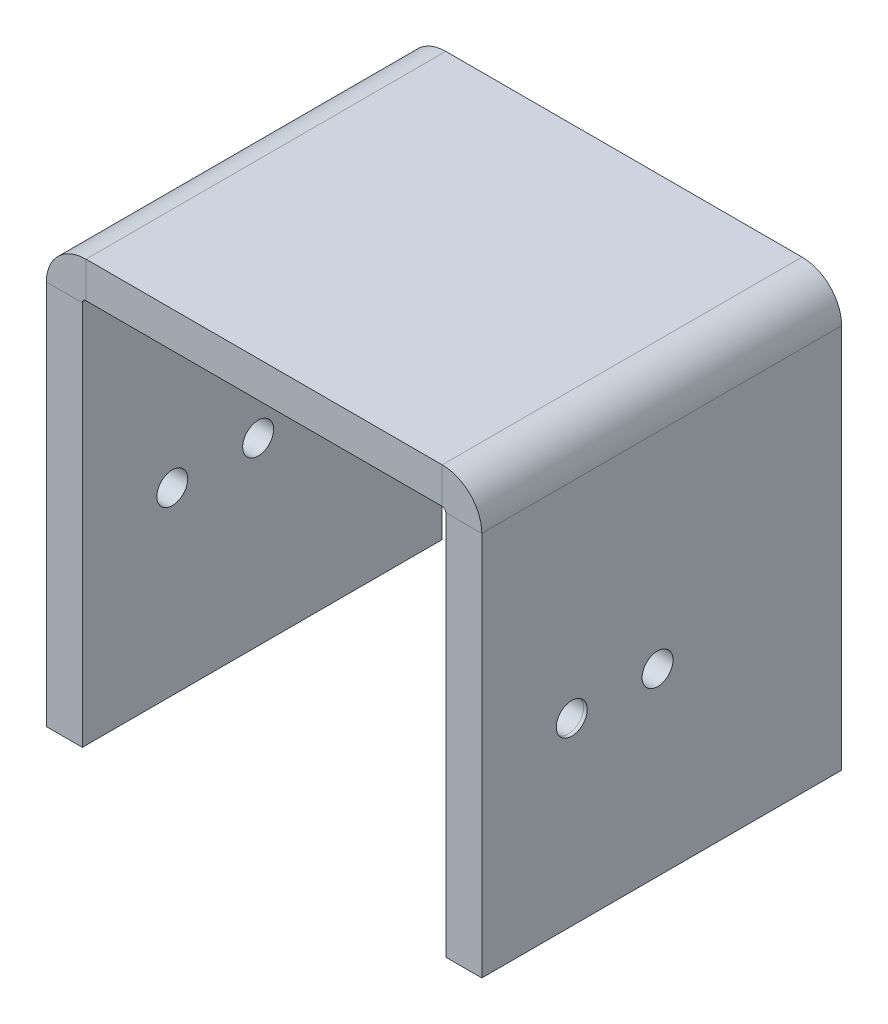
ISO-10303-21;
HEADER;
FILE_DESCRIPTION(('STEP AP214'),'2;1');
FILE_NAME('part.step','',(''),(''),'','','');
FILE_SCHEMA(('AUTOMOTIVE_DESIGN { 1 0 10303 214 1 1 1 1 }'));
ENDSEC;
DATA;
#1=APPLICATION_CONTEXT('core data for automotive mechanical design processes');
#2=APPLICATION_PROTOCOL_DEFINITION('international standard','automotive_design',2000,#1);
#3=PRODUCT_CONTEXT('',#1,'mechanical');
#4=PRODUCT('Part','Part','',(#3));
#5=PRODUCT_RELATED_PRODUCT_CATEGORY('part','',(#4));
#6=PRODUCT_DEFINITION_FORMATION('','',#4);
#7=PRODUCT_DEFINITION_CONTEXT('part definition',#1,'design');
#8=PRODUCT_DEFINITION('design','',#6,#7);
#9=PRODUCT_DEFINITION_SHAPE('','',#8);
#10=(LENGTH_UNIT() NAMED_UNIT(*) SI_UNIT(.MILLI.,.METRE.));
#11=(NAMED_UNIT(*) PLANE_ANGLE_UNIT() SI_UNIT($,.RADIAN.));
#12=(NAMED_UNIT(*) SI_UNIT($,.STERADIAN.) SOLID_ANGLE_UNIT());
#13=UNCERTAINTY_MEASURE_WITH_UNIT(LENGTH_MEASURE(1.E-05),#10,'distance_accuracy_value','');
#14=(GEOMETRIC_REPRESENTATION_CONTEXT(3) GLOBAL_UNCERTAINTY_ASSIGNED_CONTEXT((#13)) GLOBAL_UNIT_ASSIGNED_CONTEXT((#10,
#11,#12)) REPRESENTATION_CONTEXT('',''));
#15=CARTESIAN_POINT('',(0.,0.,0.));
#16=DIRECTION('',(0.,0.,1.));
#17=DIRECTION('',(1.,0.,0.));
#18=AXIS2_PLACEMENT_3D('',#15,#16,#17);
#19=CARTESIAN_POINT('',(29.75,-4.00000000000017,37.5));
#20=DIRECTION('',(-1.,0.,0.));
#21=DIRECTION('',(0.,-1.,0.));
#22=AXIS2_PLACEMENT_3D('',#19,#20,#21);
#23=CYLINDRICAL_SURFACE('',#22,2.15);
#24=CARTESIAN_POINT('',(-30.25,-4.00000000000018,37.5));
#25=DIRECTION('',(1.,0.,0.));
#26=DIRECTION('',(0.,-1.,0.));
#27=AXIS2_PLACEMENT_3D('',#24,#25,#26);
#28=CIRCLE('',#27,2.15);
#29=CARTESIAN_POINT('',(-30.25,-6.15000000000018,37.5));
#30=VERTEX_POINT('',#29);
#31=EDGE_CURVE('E248',#30,#30,#28,.T.);
#32=ORIENTED_EDGE('',*,*,#31,.F.);
#33=EDGE_LOOP('',(#32));
#34=FACE_BOUND('',#33,.T.);
#35=CARTESIAN_POINT('',(-29.75,-4.00000000000018,37.5));
#36=DIRECTION('',(1.,0.,0.));
#37=DIRECTION('',(0.,1.,0.));
#38=AXIS2_PLACEMENT_3D('',#35,#36,#37);
#39=CIRCLE('',#38,2.15);
#40=CARTESIAN_POINT('',(-29.75,-1.85000000000018,37.5));
#41=VERTEX_POINT('',#40);
#42=EDGE_CURVE('E12',#41,#41,#39,.T.);
#43=ORIENTED_EDGE('',*,*,#42,.T.);
#44=EDGE_LOOP('',(#43));
#45=FACE_BOUND('',#44,.T.);
#46=ADVANCED_FACE('F37',(#34,#45),#23,.F.);
#47=CARTESIAN_POINT('',(24.75,24.9999999999997,50.));
#48=DIRECTION('',(0.,0.,1.));
#49=DIRECTION('',(1.,0.,0.));
#50=AXIS2_PLACEMENT_3D('',#47,#48,#49);
#51=PLANE('',#50);
#52=DIRECTION('',(0.,1.,0.));
#53=VECTOR('',#52,1.);
#54=CARTESIAN_POINT('',(24.75,24.9999999999997,50.));
#55=LINE('',#54,#53);
#56=CARTESIAN_POINT('',(24.75,24.9999999999997,50.));
#57=VERTEX_POINT('',#56);
#58=CARTESIAN_POINT('',(24.75,29.9999999999997,50.));
#59=VERTEX_POINT('',#58);
#60=EDGE_CURVE('E46',#57,#59,#55,.T.);
#61=ORIENTED_EDGE('',*,*,#60,.F.);
#62=CARTESIAN_POINT('',(24.75,24.4999999999997,50.));
#63=DIRECTION('',(0.,0.,-1.));
#64=DIRECTION('',(-1.,0.,0.));
#65=AXIS2_PLACEMENT_3D('',#62,#63,#64);
#66=CIRCLE('',#65,0.5);
#67=CARTESIAN_POINT('',(25.25,24.4999999999997,50.));
#68=VERTEX_POINT('',#67);
#69=EDGE_CURVE('E304',#68,#57,#66,.F.);
#70=ORIENTED_EDGE('',*,*,#69,.F.);
#71=DIRECTION('',(-1.,0.,0.));
#72=VECTOR('',#71,1.);
#73=CARTESIAN_POINT('',(30.25,24.4999999999997,50.));
#74=LINE('',#73,#72);
#75=CARTESIAN_POINT('',(30.25,24.4999999999997,50.));
#76=VERTEX_POINT('',#75);
#77=EDGE_CURVE('E147',#76,#68,#74,.T.);
#78=ORIENTED_EDGE('',*,*,#77,.F.);
#79=CARTESIAN_POINT('',(24.75,24.4999999999997,50.));
#80=DIRECTION('',(0.,0.,1.));
#81=DIRECTION('',(1.,0.,0.));
#82=AXIS2_PLACEMENT_3D('',#79,#80,#81);
#83=CIRCLE('',#82,5.5);
#84=EDGE_CURVE('E150',#76,#59,#83,.T.);
#85=ORIENTED_EDGE('',*,*,#84,.T.);
#86=EDGE_LOOP('',(#61,#70,#78,#85));
#87=FACE_BOUND('',#86,.T.);
#88=ADVANCED_FACE('F39',(#87),#51,.T.);
#89=CARTESIAN_POINT('',(30.25,24.4999999999997,50.));
#90=DIRECTION('',(0.,0.,1.));
#91=DIRECTION('',(1.,0.,0.));
#92=AXIS2_PLACEMENT_3D('',#89,#90,#91);
#93=PLANE('',#92);
#94=DIRECTION('',(-1.,0.,0.));
#95=VECTOR('',#94,1.);
#96=CARTESIAN_POINT('',(-25.25,24.9999999999997,50.));
#97=LINE('',#96,#95);
#98=CARTESIAN_POINT('',(-24.75,24.9999999999997,50.));
#99=VERTEX_POINT('',#98);
#100=EDGE_CURVE('E142',#57,#99,#97,.T.);
#101=ORIENTED_EDGE('',*,*,#100,.F.);
#102=ORIENTED_EDGE('',*,*,#60,.T.);
#103=DIRECTION('',(1.,0.,0.));
#104=VECTOR('',#103,1.);
#105=CARTESIAN_POINT('',(-25.25,29.9999999999997,50.));
#106=LINE('',#105,#104);
#107=CARTESIAN_POINT('',(-24.75,29.9999999999997,50.));
#108=VERTEX_POINT('',#107);
#109=EDGE_CURVE('E139',#59,#108,#106,.F.);
#110=ORIENTED_EDGE('',*,*,#109,.T.);
#111=DIRECTION('',(0.,-1.,0.));
#112=VECTOR('',#111,1.);
#113=CARTESIAN_POINT('',(-24.75,29.9999999999997,50.));
#114=LINE('',#113,#112);
#115=EDGE_CURVE('E233',#108,#99,#114,.T.);
#116=ORIENTED_EDGE('',*,*,#115,.T.);
#117=EDGE_LOOP('',(#101,#102,#110,#116));
#118=FACE_BOUND('',#117,.T.);
#119=ADVANCED_FACE('F137',(#118),#93,.T.);
#120=CARTESIAN_POINT('',(25.25,24.4999999999997,0.));
#121=DIRECTION('',(0.,0.,-1.));
#122=DIRECTION('',(-1.,0.,0.));
#123=AXIS2_PLACEMENT_3D('',#120,#121,#122);
#124=PLANE('',#123);
#125=DIRECTION('',(1.,0.,0.));
#126=VECTOR('',#125,1.);
#127=CARTESIAN_POINT('',(25.25,24.4999999999997,0.));
#128=LINE('',#127,#126);
#129=CARTESIAN_POINT('',(25.25,24.4999999999997,0.));
#130=VERTEX_POINT('',#129);
#131=CARTESIAN_POINT('',(30.25,24.4999999999997,0.));
#132=VERTEX_POINT('',#131);
#133=EDGE_CURVE('E238',#130,#132,#128,.T.);
#134=ORIENTED_EDGE('',*,*,#133,.F.);
#135=CARTESIAN_POINT('',(24.75,24.4999999999997,0.));
#136=DIRECTION('',(0.,0.,-1.));
#137=DIRECTION('',(-1.,0.,0.));
#138=AXIS2_PLACEMENT_3D('',#135,#136,#137);
#139=CIRCLE('',#138,0.5);
#140=CARTESIAN_POINT('',(24.75,24.9999999999997,0.));
#141=VERTEX_POINT('',#140);
#142=EDGE_CURVE('E190',#130,#141,#139,.F.);
#143=ORIENTED_EDGE('',*,*,#142,.T.);
#144=DIRECTION('',(0.,-1.,0.));
#145=VECTOR('',#144,1.);
#146=CARTESIAN_POINT('',(24.75,29.9999999999997,0.));
#147=LINE('',#146,#145);
#148=CARTESIAN_POINT('',(24.75,29.9999999999997,0.));
#149=VERTEX_POINT('',#148);
#150=EDGE_CURVE('E236',#149,#141,#147,.T.);
#151=ORIENTED_EDGE('',*,*,#150,.F.);
#152=CARTESIAN_POINT('',(24.75,24.4999999999997,0.));
#153=DIRECTION('',(0.,0.,1.));
#154=DIRECTION('',(1.,0.,0.));
#155=AXIS2_PLACEMENT_3D('',#152,#153,#154);
#156=CIRCLE('',#155,5.5);
#157=EDGE_CURVE('E162',#132,#149,#156,.T.);
#158=ORIENTED_EDGE('',*,*,#157,.F.);
#159=EDGE_LOOP('',(#134,#143,#151,#158));
#160=FACE_BOUND('',#159,.T.);
#161=ADVANCED_FACE('F322',(#160),#124,.T.);
#162=CARTESIAN_POINT('',(24.75,29.9999999999997,0.));
#163=DIRECTION('',(0.,0.,-1.));
#164=DIRECTION('',(-1.,0.,0.));
#165=AXIS2_PLACEMENT_3D('',#162,#163,#164);
#166=PLANE('',#165);
#167=DIRECTION('',(0.,1.,0.));
#168=VECTOR('',#167,1.);
#169=CARTESIAN_POINT('',(25.25,24.9999999999997,0.));
#170=LINE('',#169,#168);
#171=CARTESIAN_POINT('',(25.25,-29.0000000000003,0.));
#172=VERTEX_POINT('',#171);
#173=EDGE_CURVE('E193',#172,#130,#170,.T.);
#174=ORIENTED_EDGE('',*,*,#173,.T.);
#175=ORIENTED_EDGE('',*,*,#133,.T.);
#176=DIRECTION('',(0.,1.,0.));
#177=VECTOR('',#176,1.);
#178=CARTESIAN_POINT('',(30.25,24.9999999999997,0.));
#179=LINE('',#178,#177);
#180=CARTESIAN_POINT('',(30.25,-29.0000000000003,0.));
#181=VERTEX_POINT('',#180);
#182=EDGE_CURVE('E199',#181,#132,#179,.T.);
#183=ORIENTED_EDGE('',*,*,#182,.F.);
#184=DIRECTION('',(-1.,0.,0.));
#185=VECTOR('',#184,1.);
#186=CARTESIAN_POINT('',(30.25,-29.0000000000003,0.));
#187=LINE('',#186,#185);
#188=EDGE_CURVE('E196',#181,#172,#187,.T.);
#189=ORIENTED_EDGE('',*,*,#188,.T.);
#190=EDGE_LOOP('',(#174,#175,#183,#189));
#191=FACE_BOUND('',#190,.T.);
#192=ADVANCED_FACE('F723',(#191),#166,.T.);
#193=CARTESIAN_POINT('',(-25.25,24.4999999999997,50.));
#194=DIRECTION('',(0.,0.,1.));
#195=DIRECTION('',(1.,0.,0.));
#196=AXIS2_PLACEMENT_3D('',#193,#194,#195);
#197=PLANE('',#196);
#198=DIRECTION('',(-1.,0.,0.));
#199=VECTOR('',#198,1.);
#200=CARTESIAN_POINT('',(-25.25,24.4999999999997,50.));
#201=LINE('',#200,#199);
#202=CARTESIAN_POINT('',(-25.25,24.4999999999997,50.));
#203=VERTEX_POINT('',#202);
#204=CARTESIAN_POINT('',(-30.25,24.4999999999997,50.));
#205=VERTEX_POINT('',#204);
#206=EDGE_CURVE('E54',#203,#205,#201,.T.);
#207=ORIENTED_EDGE('',*,*,#206,.F.);
#208=CARTESIAN_POINT('',(-24.75,24.4999999999997,50.));
#209=DIRECTION('',(0.,0.,-1.));
#210=DIRECTION('',(-1.,0.,0.));
#211=AXIS2_PLACEMENT_3D('',#208,#209,#210);
#212=CIRCLE('',#211,0.5);
#213=EDGE_CURVE('E300',#99,#203,#212,.F.);
#214=ORIENTED_EDGE('',*,*,#213,.F.);
#215=ORIENTED_EDGE('',*,*,#115,.F.);
#216=CARTESIAN_POINT('',(-24.75,24.4999999999997,50.));
#217=DIRECTION('',(0.,0.,1.));
#218=DIRECTION('',(1.,0.,0.));
#219=AXIS2_PLACEMENT_3D('',#216,#217,#218);
#220=CIRCLE('',#219,5.5);
#221=EDGE_CURVE('E170',#108,#205,#220,.T.);
#222=ORIENTED_EDGE('',*,*,#221,.T.);
#223=EDGE_LOOP('',(#207,#214,#215,#222));
#224=FACE_BOUND('',#223,.T.);
#225=ADVANCED_FACE('F713',(#224),#197,.T.);
#226=CARTESIAN_POINT('',(-24.75,29.9999999999997,50.));
#227=DIRECTION('',(0.,0.,1.));
#228=DIRECTION('',(1.,0.,0.));
#229=AXIS2_PLACEMENT_3D('',#226,#227,#228);
#230=PLANE('',#229);
#231=DIRECTION('',(0.,-1.,0.));
#232=VECTOR('',#231,1.);
#233=CARTESIAN_POINT('',(-25.25,24.9999999999997,50.));
#234=LINE('',#233,#232);
#235=CARTESIAN_POINT('',(-25.25,-29.0000000000003,50.));
#236=VERTEX_POINT('',#235);
#237=EDGE_CURVE('E297',#203,#236,#234,.T.);
#238=ORIENTED_EDGE('',*,*,#237,.F.);
#239=ORIENTED_EDGE('',*,*,#206,.T.);
#240=DIRECTION('',(0.,-1.,0.));
#241=VECTOR('',#240,1.);
#242=CARTESIAN_POINT('',(-30.25,24.9999999999997,50.));
#243=LINE('',#242,#241);
#244=CARTESIAN_POINT('',(-30.25,-29.0000000000003,50.));
#245=VERTEX_POINT('',#244);
#246=EDGE_CURVE('E108',#205,#245,#243,.T.);
#247=ORIENTED_EDGE('',*,*,#246,.T.);
#248=DIRECTION('',(-1.,0.,0.));
#249=VECTOR('',#248,1.);
#250=CARTESIAN_POINT('',(-25.25,-29.0000000000003,50.));
#251=LINE('',#250,#249);
#252=EDGE_CURVE('E294',#236,#245,#251,.T.);
#253=ORIENTED_EDGE('',*,*,#252,.F.);
#254=EDGE_LOOP('',(#238,#239,#247,#253));
#255=FACE_BOUND('',#254,.T.);
#256=ADVANCED_FACE('F349',(#255),#230,.T.);
#257=CARTESIAN_POINT('',(-24.75,24.9999999999997,0.));
#258=DIRECTION('',(0.,0.,-1.));
#259=DIRECTION('',(-1.,0.,0.));
#260=AXIS2_PLACEMENT_3D('',#257,#258,#259);
#261=PLANE('',#260);
#262=DIRECTION('',(0.,1.,0.));
#263=VECTOR('',#262,1.);
#264=CARTESIAN_POINT('',(-24.75,24.9999999999997,0.));
#265=LINE('',#264,#263);
#266=CARTESIAN_POINT('',(-24.75,24.9999999999997,0.));
#267=VERTEX_POINT('',#266);
#268=CARTESIAN_POINT('',(-24.75,29.9999999999997,0.));
#269=VERTEX_POINT('',#268);
#270=EDGE_CURVE('E95',#267,#269,#265,.T.);
#271=ORIENTED_EDGE('',*,*,#270,.F.);
#272=CARTESIAN_POINT('',(-24.75,24.4999999999997,0.));
#273=DIRECTION('',(0.,0.,-1.));
#274=DIRECTION('',(-1.,0.,0.));
#275=AXIS2_PLACEMENT_3D('',#272,#273,#274);
#276=CIRCLE('',#275,0.5);
#277=CARTESIAN_POINT('',(-25.25,24.4999999999997,0.));
#278=VERTEX_POINT('',#277);
#279=EDGE_CURVE('E186',#267,#278,#276,.F.);
#280=ORIENTED_EDGE('',*,*,#279,.T.);
#281=DIRECTION('',(1.,0.,0.));
#282=VECTOR('',#281,1.);
#283=CARTESIAN_POINT('',(-30.25,24.4999999999997,0.));
#284=LINE('',#283,#282);
#285=CARTESIAN_POINT('',(-30.25,24.4999999999997,0.));
#286=VERTEX_POINT('',#285);
#287=EDGE_CURVE('E102',#286,#278,#284,.T.);
#288=ORIENTED_EDGE('',*,*,#287,.F.);
#289=CARTESIAN_POINT('',(-24.75,24.4999999999997,0.));
#290=DIRECTION('',(0.,0.,1.));
#291=DIRECTION('',(1.,0.,0.));
#292=AXIS2_PLACEMENT_3D('',#289,#290,#291);
#293=CIRCLE('',#292,5.5);
#294=EDGE_CURVE('E205',#269,#286,#293,.T.);
#295=ORIENTED_EDGE('',*,*,#294,.F.);
#296=EDGE_LOOP('',(#271,#280,#288,#295));
#297=FACE_BOUND('',#296,.T.);
#298=ADVANCED_FACE('F337',(#297),#261,.T.);
#299=CARTESIAN_POINT('',(-30.25,24.4999999999997,0.));
#300=DIRECTION('',(0.,0.,-1.));
#301=DIRECTION('',(-1.,0.,0.));
#302=AXIS2_PLACEMENT_3D('',#299,#300,#301);
#303=PLANE('',#302);
#304=DIRECTION('',(-1.,0.,0.));
#305=VECTOR('',#304,1.);
#306=CARTESIAN_POINT('',(-25.25,24.9999999999997,0.));
#307=LINE('',#306,#305);
#308=EDGE_CURVE('E188',#141,#267,#307,.T.);
#309=ORIENTED_EDGE('',*,*,#308,.T.);
#310=ORIENTED_EDGE('',*,*,#270,.T.);
#311=DIRECTION('',(1.,0.,0.));
#312=VECTOR('',#311,1.);
#313=CARTESIAN_POINT('',(-25.25,29.9999999999997,0.));
#314=LINE('',#313,#312);
#315=EDGE_CURVE('E203',#149,#269,#314,.F.);
#316=ORIENTED_EDGE('',*,*,#315,.F.);
#317=ORIENTED_EDGE('',*,*,#150,.T.);
#318=EDGE_LOOP('',(#309,#310,#316,#317));
#319=FACE_BOUND('',#318,.T.);
#320=ADVANCED_FACE('F324',(#319),#303,.T.);
#321=CARTESIAN_POINT('',(-30.25,24.9999999999997,50.));
#322=DIRECTION('',(1.,0.,0.));
#323=DIRECTION('',(0.,1.,0.));
#324=AXIS2_PLACEMENT_3D('',#321,#322,#323);
#325=PLANE('',#324);
#326=ORIENTED_EDGE('',*,*,#31,.T.);
#327=EDGE_LOOP('',(#326));
#328=FACE_BOUND('',#327,.T.);
#329=CARTESIAN_POINT('',(-30.25,-4.00000000000018,12.5));
#330=DIRECTION('',(-1.,0.,0.));
#331=DIRECTION('',(0.,-1.,0.));
#332=AXIS2_PLACEMENT_3D('',#329,#330,#331);
#333=CIRCLE('',#332,2.15);
#334=CARTESIAN_POINT('',(-30.25,-6.15000000000018,12.5));
#335=VERTEX_POINT('',#334);
#336=EDGE_CURVE('E252',#335,#335,#333,.T.);
#337=ORIENTED_EDGE('',*,*,#336,.F.);
#338=EDGE_LOOP('',(#337));
#339=FACE_BOUND('',#338,.T.);
#340=DIRECTION('',(0.,-1.,0.));
#341=VECTOR('',#340,1.);
#342=CARTESIAN_POINT('',(-30.25,24.9999999999997,0.));
#343=LINE('',#342,#341);
#344=CARTESIAN_POINT('',(-30.25,-29.0000000000003,0.));
#345=VERTEX_POINT('',#344);
#346=EDGE_CURVE('E176',#286,#345,#343,.T.);
#347=ORIENTED_EDGE('',*,*,#346,.T.);
#348=DIRECTION('',(0.,0.,-1.));
#349=VECTOR('',#348,1.);
#350=CARTESIAN_POINT('',(-30.25,-29.0000000000003,50.));
#351=LINE('',#350,#349);
#352=EDGE_CURVE('E229',#245,#345,#351,.T.);
#353=ORIENTED_EDGE('',*,*,#352,.F.);
#354=ORIENTED_EDGE('',*,*,#246,.F.);
#355=DIRECTION('',(0.,0.,-1.));
#356=VECTOR('',#355,1.);
#357=CARTESIAN_POINT('',(-30.25,24.4999999999997,50.));
#358=LINE('',#357,#356);
#359=EDGE_CURVE('E172',#205,#286,#358,.T.);
#360=ORIENTED_EDGE('',*,*,#359,.T.);
#361=EDGE_LOOP('',(#347,#353,#354,#360));
#362=FACE_BOUND('',#361,.T.);
#363=ADVANCED_FACE('F343',(#328,#339,#362),#325,.F.);
#364=CARTESIAN_POINT('',(-25.25,-29.0000000000003,50.));
#365=DIRECTION('',(0.,-1.,0.));
#366=DIRECTION('',(0.,0.,-1.));
#367=AXIS2_PLACEMENT_3D('',#364,#365,#366);
#368=PLANE('',#367);
#369=DIRECTION('',(-1.,0.,0.));
#370=VECTOR('',#369,1.);
#371=CARTESIAN_POINT('',(-25.25,-29.0000000000003,0.));
#372=LINE('',#371,#370);
#373=CARTESIAN_POINT('',(-25.25,-29.0000000000003,0.));
#374=VERTEX_POINT('',#373);
#375=EDGE_CURVE('E179',#374,#345,#372,.T.);
#376=ORIENTED_EDGE('',*,*,#375,.F.);
#377=DIRECTION('',(0.,0.,-1.));
#378=VECTOR('',#377,1.);
#379=CARTESIAN_POINT('',(-25.25,-29.0000000000003,50.));
#380=LINE('',#379,#378);
#381=EDGE_CURVE('E227',#236,#374,#380,.T.);
#382=ORIENTED_EDGE('',*,*,#381,.F.);
#383=ORIENTED_EDGE('',*,*,#252,.T.);
#384=ORIENTED_EDGE('',*,*,#352,.T.);
#385=EDGE_LOOP('',(#376,#382,#383,#384));
#386=FACE_BOUND('',#385,.T.);
#387=ADVANCED_FACE('F348',(#386),#368,.T.);
#388=CARTESIAN_POINT('',(-25.25,24.9999999999997,50.));
#389=DIRECTION('',(1.,0.,0.));
#390=DIRECTION('',(0.,1.,0.));
#391=AXIS2_PLACEMENT_3D('',#388,#389,#390);
#392=PLANE('',#391);
#393=CARTESIAN_POINT('',(-25.25,-4.00000000000018,25.5741949753525));
#394=DIRECTION('',(1.,0.,0.));
#395=DIRECTION('',(0.,1.,0.));
#396=AXIS2_PLACEMENT_3D('',#393,#394,#395);
#397=CIRCLE('',#396,2.15);
#398=CARTESIAN_POINT('',(-25.25,-1.85000000000018,25.5741949753525));
#399=VERTEX_POINT('',#398);
#400=EDGE_CURVE('E255',#399,#399,#397,.T.);
#401=ORIENTED_EDGE('',*,*,#400,.F.);
#402=EDGE_LOOP('',(#401));
#403=FACE_BOUND('',#402,.T.);
#404=CARTESIAN_POINT('',(-25.25,-4.00000000000018,37.5));
#405=DIRECTION('',(1.,0.,0.));
#406=DIRECTION('',(0.,1.,0.));
#407=AXIS2_PLACEMENT_3D('',#404,#405,#406);
#408=CIRCLE('',#407,2.15);
#409=CARTESIAN_POINT('',(-25.25,-1.85000000000018,37.5));
#410=VERTEX_POINT('',#409);
#411=EDGE_CURVE('E247',#410,#410,#408,.F.);
#412=ORIENTED_EDGE('',*,*,#411,.T.);
#413=EDGE_LOOP('',(#412));
#414=FACE_BOUND('',#413,.T.);
#415=CARTESIAN_POINT('',(-25.25,-4.00000000000018,12.5));
#416=DIRECTION('',(1.,0.,0.));
#417=DIRECTION('',(0.,1.,0.));
#418=AXIS2_PLACEMENT_3D('',#415,#416,#417);
#419=CIRCLE('',#418,2.15);
#420=CARTESIAN_POINT('',(-25.25,-1.85000000000018,12.5));
#421=VERTEX_POINT('',#420);
#422=EDGE_CURVE('E243',#421,#421,#419,.T.);
#423=ORIENTED_EDGE('',*,*,#422,.F.);
#424=EDGE_LOOP('',(#423));
#425=FACE_BOUND('',#424,.T.);
#426=DIRECTION('',(0.,-1.,0.));
#427=VECTOR('',#426,1.);
#428=CARTESIAN_POINT('',(-25.25,24.9999999999997,0.));
#429=LINE('',#428,#427);
#430=EDGE_CURVE('E183',#278,#374,#429,.T.);
#431=ORIENTED_EDGE('',*,*,#430,.F.);
#432=DIRECTION('',(0.,0.,-1.));
#433=VECTOR('',#432,1.);
#434=CARTESIAN_POINT('',(-25.25,24.4999999999997,50.));
#435=LINE('',#434,#433);
#436=EDGE_CURVE('E224',#203,#278,#435,.T.);
#437=ORIENTED_EDGE('',*,*,#436,.F.);
#438=ORIENTED_EDGE('',*,*,#237,.T.);
#439=ORIENTED_EDGE('',*,*,#381,.T.);
#440=EDGE_LOOP('',(#431,#437,#438,#439));
#441=FACE_BOUND('',#440,.T.);
#442=ADVANCED_FACE('F351',(#403,#414,#425,#441),#392,.T.);
#443=CARTESIAN_POINT('',(-24.75,24.4999999999997,50.));
#444=DIRECTION('',(0.,0.,-1.));
#445=DIRECTION('',(-1.,0.,0.));
#446=AXIS2_PLACEMENT_3D('',#443,#444,#445);
#447=CYLINDRICAL_SURFACE('',#446,0.5);
#448=ORIENTED_EDGE('',*,*,#279,.F.);
#449=DIRECTION('',(0.,0.,-1.));
#450=VECTOR('',#449,1.);
#451=CARTESIAN_POINT('',(-24.75,24.9999999999997,50.));
#452=LINE('',#451,#450);
#453=EDGE_CURVE('E221',#99,#267,#452,.T.);
#454=ORIENTED_EDGE('',*,*,#453,.F.);
#455=ORIENTED_EDGE('',*,*,#213,.T.);
#456=ORIENTED_EDGE('',*,*,#436,.T.);
#457=EDGE_LOOP('',(#448,#454,#455,#456));
#458=FACE_BOUND('',#457,.T.);
#459=ADVANCED_FACE('F334',(#458),#447,.F.);
#460=CARTESIAN_POINT('',(-25.25,24.9999999999997,50.));
#461=DIRECTION('',(0.,-1.,0.));
#462=DIRECTION('',(0.,0.,-1.));
#463=AXIS2_PLACEMENT_3D('',#460,#461,#462);
#464=PLANE('',#463);
#465=CARTESIAN_POINT('',(-14.9999999999999,24.9999999999997,9.89596793341776));
#466=DIRECTION('',(0.,-1.,0.));
#467=DIRECTION('',(1.,0.,0.));
#468=AXIS2_PLACEMENT_3D('',#465,#466,#467);
#469=CIRCLE('',#468,1.65);
#470=CARTESIAN_POINT('',(-13.3499999999999,24.9999999999997,9.89596793341777));
#471=VERTEX_POINT('',#470);
#472=EDGE_CURVE('E275',#471,#471,#469,.T.);
#473=ORIENTED_EDGE('',*,*,#472,.F.);
#474=EDGE_LOOP('',(#473));
#475=FACE_BOUND('',#474,.T.);
#476=CARTESIAN_POINT('',(15.1040320665822,24.9999999999997,9.89596793341782));
#477=DIRECTION('',(0.,-1.,0.));
#478=DIRECTION('',(0.,0.,1.));
#479=AXIS2_PLACEMENT_3D('',#476,#477,#478);
#480=CIRCLE('',#479,1.65);
#481=CARTESIAN_POINT('',(15.1040320665822,24.9999999999997,11.5459679334178));
#482=VERTEX_POINT('',#481);
#483=EDGE_CURVE('E281',#482,#482,#480,.T.);
#484=ORIENTED_EDGE('',*,*,#483,.F.);
#485=EDGE_LOOP('',(#484));
#486=FACE_BOUND('',#485,.T.);
#487=CARTESIAN_POINT('',(15.104032066582,24.9999999999997,40.0000000000002));
#488=DIRECTION('',(0.,-1.,0.));
#489=DIRECTION('',(-1.,0.,0.));
#490=AXIS2_PLACEMENT_3D('',#487,#488,#489);
#491=CIRCLE('',#490,1.65);
#492=CARTESIAN_POINT('',(13.454032066582,24.9999999999997,40.0000000000002));
#493=VERTEX_POINT('',#492);
#494=EDGE_CURVE('E270',#493,#493,#491,.T.);
#495=ORIENTED_EDGE('',*,*,#494,.F.);
#496=EDGE_LOOP('',(#495));
#497=FACE_BOUND('',#496,.T.);
#498=CARTESIAN_POINT('',(-15.,24.9999999999997,40.));
#499=DIRECTION('',(0.,-1.,0.));
#500=DIRECTION('',(0.,0.,-1.));
#501=AXIS2_PLACEMENT_3D('',#498,#499,#500);
#502=CIRCLE('',#501,1.65);
#503=CARTESIAN_POINT('',(-15.,24.9999999999997,38.35));
#504=VERTEX_POINT('',#503);
#505=EDGE_CURVE('E274',#504,#504,#502,.T.);
#506=ORIENTED_EDGE('',*,*,#505,.F.);
#507=EDGE_LOOP('',(#506));
#508=FACE_BOUND('',#507,.T.);
#509=ORIENTED_EDGE('',*,*,#308,.F.);
#510=DIRECTION('',(0.,0.,-1.));
#511=VECTOR('',#510,1.);
#512=CARTESIAN_POINT('',(24.75,24.9999999999997,50.));
#513=LINE('',#512,#511);
#514=EDGE_CURVE('E218',#57,#141,#513,.T.);
#515=ORIENTED_EDGE('',*,*,#514,.F.);
#516=ORIENTED_EDGE('',*,*,#100,.T.);
#517=ORIENTED_EDGE('',*,*,#453,.T.);
#518=EDGE_LOOP('',(#509,#515,#516,#517));
#519=FACE_BOUND('',#518,.T.);
#520=ADVANCED_FACE('F329',(#475,#486,#497,#508,#519),#464,.T.);
#521=CARTESIAN_POINT('',(24.75,24.4999999999997,50.));
#522=DIRECTION('',(0.,0.,-1.));
#523=DIRECTION('',(-1.,0.,0.));
#524=AXIS2_PLACEMENT_3D('',#521,#522,#523);
#525=CYLINDRICAL_SURFACE('',#524,0.5);
#526=ORIENTED_EDGE('',*,*,#142,.F.);
#527=DIRECTION('',(0.,0.,-1.));
#528=VECTOR('',#527,1.);
#529=CARTESIAN_POINT('',(25.25,24.4999999999997,50.));
#530=LINE('',#529,#528);
#531=EDGE_CURVE('E215',#68,#130,#530,.T.);
#532=ORIENTED_EDGE('',*,*,#531,.F.);
#533=ORIENTED_EDGE('',*,*,#69,.T.);
#534=ORIENTED_EDGE('',*,*,#514,.T.);
#535=EDGE_LOOP('',(#526,#532,#533,#534));
#536=FACE_BOUND('',#535,.T.);
#537=ADVANCED_FACE('F327',(#536),#525,.F.);
#538=CARTESIAN_POINT('',(25.25,24.9999999999997,50.));
#539=DIRECTION('',(-1.,0.,0.));
#540=DIRECTION('',(0.,-1.,0.));
#541=AXIS2_PLACEMENT_3D('',#538,#539,#540);
#542=PLANE('',#541);
#543=CARTESIAN_POINT('',(25.25,-4.00000000000017,25.5741949753525));
#544=DIRECTION('',(-1.,0.,0.));
#545=DIRECTION('',(0.,-1.,0.));
#546=AXIS2_PLACEMENT_3D('',#543,#544,#545);
#547=CIRCLE('',#546,2.15);
#548=CARTESIAN_POINT('',(25.25,-6.15000000000017,25.5741949753525));
#549=VERTEX_POINT('',#548);
#550=EDGE_CURVE('E260',#549,#549,#547,.T.);
#551=ORIENTED_EDGE('',*,*,#550,.F.);
#552=EDGE_LOOP('',(#551));
#553=FACE_BOUND('',#552,.T.);
#554=CARTESIAN_POINT('',(25.25,-4.00000000000017,37.5));
#555=DIRECTION('',(-1.,0.,0.));
#556=DIRECTION('',(0.,-1.,0.));
#557=AXIS2_PLACEMENT_3D('',#554,#555,#556);
#558=CIRCLE('',#557,2.15);
#559=CARTESIAN_POINT('',(25.25,-6.15000000000017,37.5));
#560=VERTEX_POINT('',#559);
#561=EDGE_CURVE('E245',#560,#560,#558,.F.);
#562=ORIENTED_EDGE('',*,*,#561,.T.);
#563=EDGE_LOOP('',(#562));
#564=FACE_BOUND('',#563,.T.);
#565=CARTESIAN_POINT('',(25.25,-4.00000000000017,12.5));
#566=DIRECTION('',(-1.,0.,0.));
#567=DIRECTION('',(0.,-1.,0.));
#568=AXIS2_PLACEMENT_3D('',#565,#566,#567);
#569=CIRCLE('',#568,2.15);
#570=CARTESIAN_POINT('',(25.25,-6.15000000000017,12.5));
#571=VERTEX_POINT('',#570);
#572=EDGE_CURVE('E241',#571,#571,#569,.T.);
#573=ORIENTED_EDGE('',*,*,#572,.F.);
#574=EDGE_LOOP('',(#573));
#575=FACE_BOUND('',#574,.T.);
#576=ORIENTED_EDGE('',*,*,#173,.F.);
#577=DIRECTION('',(0.,0.,-1.));
#578=VECTOR('',#577,1.);
#579=CARTESIAN_POINT('',(25.25,-29.0000000000003,50.));
#580=LINE('',#579,#578);
#581=CARTESIAN_POINT('',(25.25,-29.0000000000003,50.));
#582=VERTEX_POINT('',#581);
#583=EDGE_CURVE('E213',#582,#172,#580,.T.);
#584=ORIENTED_EDGE('',*,*,#583,.F.);
#585=DIRECTION('',(0.,1.,0.));
#586=VECTOR('',#585,1.);
#587=CARTESIAN_POINT('',(25.25,24.9999999999997,50.));
#588=LINE('',#587,#586);
#589=EDGE_CURVE('E306',#582,#68,#588,.T.);
#590=ORIENTED_EDGE('',*,*,#589,.T.);
#591=ORIENTED_EDGE('',*,*,#531,.T.);
#592=EDGE_LOOP('',(#576,#584,#590,#591));
#593=FACE_BOUND('',#592,.T.);
#594=ADVANCED_FACE('F466',(#553,#564,#575,#593),#542,.T.);
#595=CARTESIAN_POINT('',(30.25,-29.0000000000003,50.));
#596=DIRECTION('',(0.,-1.,0.));
#597=DIRECTION('',(0.,0.,-1.));
#598=AXIS2_PLACEMENT_3D('',#595,#596,#597);
#599=PLANE('',#598);
#600=ORIENTED_EDGE('',*,*,#188,.F.);
#601=DIRECTION('',(0.,0.,-1.));
#602=VECTOR('',#601,1.);
#603=CARTESIAN_POINT('',(30.25,-29.0000000000003,50.));
#604=LINE('',#603,#602);
#605=CARTESIAN_POINT('',(30.25,-29.0000000000003,50.));
#606=VERTEX_POINT('',#605);
#607=EDGE_CURVE('E211',#606,#181,#604,.T.);
#608=ORIENTED_EDGE('',*,*,#607,.F.);
#609=DIRECTION('',(-1.,0.,0.));
#610=VECTOR('',#609,1.);
#611=CARTESIAN_POINT('',(30.25,-29.0000000000003,50.));
#612=LINE('',#611,#610);
#613=EDGE_CURVE('E309',#606,#582,#612,.T.);
#614=ORIENTED_EDGE('',*,*,#613,.T.);
#615=ORIENTED_EDGE('',*,*,#583,.T.);
#616=EDGE_LOOP('',(#600,#608,#614,#615));
#617=FACE_BOUND('',#616,.T.);
#618=ADVANCED_FACE('F408',(#617),#599,.T.);
#619=CARTESIAN_POINT('',(30.25,24.9999999999997,50.));
#620=DIRECTION('',(-1.,0.,0.));
#621=DIRECTION('',(0.,-1.,0.));
#622=AXIS2_PLACEMENT_3D('',#619,#620,#621);
#623=PLANE('',#622);
#624=CARTESIAN_POINT('',(30.25,-4.00000000000017,25.5741949753525));
#625=DIRECTION('',(1.,0.,0.));
#626=DIRECTION('',(0.,1.,0.));
#627=AXIS2_PLACEMENT_3D('',#624,#625,#626);
#628=CIRCLE('',#627,2.15);
#629=CARTESIAN_POINT('',(30.25,-1.85000000000017,25.5741949753525));
#630=VERTEX_POINT('',#629);
#631=EDGE_CURVE('E395',#630,#630,#628,.T.);
#632=ORIENTED_EDGE('',*,*,#631,.F.);
#633=EDGE_LOOP('',(#632));
#634=FACE_BOUND('',#633,.T.);
#635=CARTESIAN_POINT('',(30.25,-4.00000000000017,37.5));
#636=DIRECTION('',(1.,0.,0.));
#637=DIRECTION('',(0.,1.,0.));
#638=AXIS2_PLACEMENT_3D('',#635,#636,#637);
#639=CIRCLE('',#638,2.15);
#640=CARTESIAN_POINT('',(30.25,-1.85000000000017,37.5));
#641=VERTEX_POINT('',#640);
#642=EDGE_CURVE('E398',#641,#641,#639,.T.);
#643=ORIENTED_EDGE('',*,*,#642,.F.);
#644=EDGE_LOOP('',(#643));
#645=FACE_BOUND('',#644,.T.);
#646=ORIENTED_EDGE('',*,*,#182,.T.);
#647=DIRECTION('',(0.,0.,-1.));
#648=VECTOR('',#647,1.);
#649=CARTESIAN_POINT('',(30.25,24.4999999999997,50.));
#650=LINE('',#649,#648);
#651=EDGE_CURVE('E164',#76,#132,#650,.T.);
#652=ORIENTED_EDGE('',*,*,#651,.F.);
#653=DIRECTION('',(0.,1.,0.));
#654=VECTOR('',#653,1.);
#655=CARTESIAN_POINT('',(30.25,24.9999999999997,50.));
#656=LINE('',#655,#654);
#657=EDGE_CURVE('E155',#606,#76,#656,.T.);
#658=ORIENTED_EDGE('',*,*,#657,.F.);
#659=ORIENTED_EDGE('',*,*,#607,.T.);
#660=EDGE_LOOP('',(#646,#652,#658,#659));
#661=FACE_BOUND('',#660,.T.);
#662=ADVANCED_FACE('F319',(#634,#645,#661),#623,.F.);
#663=CARTESIAN_POINT('',(24.75,24.4999999999997,50.));
#664=DIRECTION('',(0.,0.,-1.));
#665=DIRECTION('',(-1.,0.,0.));
#666=AXIS2_PLACEMENT_3D('',#663,#664,#665);
#667=CYLINDRICAL_SURFACE('',#666,5.5);
#668=ORIENTED_EDGE('',*,*,#157,.T.);
#669=DIRECTION('',(0.,0.,-1.));
#670=VECTOR('',#669,1.);
#671=CARTESIAN_POINT('',(24.75,29.9999999999997,50.));
#672=LINE('',#671,#670);
#673=EDGE_CURVE('E159',#59,#149,#672,.T.);
#674=ORIENTED_EDGE('',*,*,#673,.F.);
#675=ORIENTED_EDGE('',*,*,#84,.F.);
#676=ORIENTED_EDGE('',*,*,#651,.T.);
#677=EDGE_LOOP('',(#668,#674,#675,#676));
#678=FACE_BOUND('',#677,.T.);
#679=ADVANCED_FACE('F160',(#678),#667,.T.);
#680=CARTESIAN_POINT('',(-25.25,29.9999999999997,50.));
#681=DIRECTION('',(0.,-1.,0.));
#682=DIRECTION('',(0.,0.,-1.));
#683=AXIS2_PLACEMENT_3D('',#680,#681,#682);
#684=PLANE('',#683);
#685=ORIENTED_EDGE('',*,*,#315,.T.);
#686=DIRECTION('',(0.,0.,-1.));
#687=VECTOR('',#686,1.);
#688=CARTESIAN_POINT('',(-24.75,29.9999999999997,50.));
#689=LINE('',#688,#687);
#690=EDGE_CURVE('E165',#108,#269,#689,.T.);
#691=ORIENTED_EDGE('',*,*,#690,.F.);
#692=ORIENTED_EDGE('',*,*,#109,.F.);
#693=ORIENTED_EDGE('',*,*,#673,.T.);
#694=EDGE_LOOP('',(#685,#691,#692,#693));
#695=FACE_BOUND('',#694,.T.);
#696=ADVANCED_FACE('F167',(#695),#684,.F.);
#697=CARTESIAN_POINT('',(-24.75,24.4999999999997,50.));
#698=DIRECTION('',(0.,0.,-1.));
#699=DIRECTION('',(-1.,0.,0.));
#700=AXIS2_PLACEMENT_3D('',#697,#698,#699);
#701=CYLINDRICAL_SURFACE('',#700,5.5);
#702=ORIENTED_EDGE('',*,*,#294,.T.);
#703=ORIENTED_EDGE('',*,*,#359,.F.);
#704=ORIENTED_EDGE('',*,*,#221,.F.);
#705=ORIENTED_EDGE('',*,*,#690,.T.);
#706=EDGE_LOOP('',(#702,#703,#704,#705));
#707=FACE_BOUND('',#706,.T.);
#708=ADVANCED_FACE('F340',(#707),#701,.T.);
#709=CARTESIAN_POINT('',(-24.75,24.4999999999997,50.));
#710=DIRECTION('',(0.,0.,-1.));
#711=DIRECTION('',(-1.,0.,0.));
#712=AXIS2_PLACEMENT_3D('',#709,#710,#711);
#713=PLANE('',#712);
#714=ORIENTED_EDGE('',*,*,#657,.T.);
#715=ORIENTED_EDGE('',*,*,#77,.T.);
#716=ORIENTED_EDGE('',*,*,#589,.F.);
#717=ORIENTED_EDGE('',*,*,#613,.F.);
#718=EDGE_LOOP('',(#714,#715,#716,#717));
#719=FACE_BOUND('',#718,.T.);
#720=ADVANCED_FACE('F315',(#719),#713,.F.);
#721=CARTESIAN_POINT('',(-24.75,24.4999999999997,0.));
#722=DIRECTION('',(0.,0.,-1.));
#723=DIRECTION('',(-1.,0.,0.));
#724=AXIS2_PLACEMENT_3D('',#721,#722,#723);
#725=PLANE('',#724);
#726=ORIENTED_EDGE('',*,*,#346,.F.);
#727=ORIENTED_EDGE('',*,*,#287,.T.);
#728=ORIENTED_EDGE('',*,*,#430,.T.);
#729=ORIENTED_EDGE('',*,*,#375,.T.);
#730=EDGE_LOOP('',(#726,#727,#728,#729));
#731=FACE_BOUND('',#730,.T.);
#732=ADVANCED_FACE('F345',(#731),#725,.T.);
#733=CARTESIAN_POINT('',(-15.,27.9999999999997,40.));
#734=DIRECTION('',(0.,-1.,0.));
#735=DIRECTION('',(0.,0.,-1.));
#736=AXIS2_PLACEMENT_3D('',#733,#734,#735);
#737=CYLINDRICAL_SURFACE('',#736,1.65);
#738=CARTESIAN_POINT('',(-15.,27.9999999999997,40.));
#739=DIRECTION('',(0.,-1.,0.));
#740=DIRECTION('',(0.,0.,-1.));
#741=AXIS2_PLACEMENT_3D('',#738,#739,#740);
#742=CIRCLE('',#741,1.65);
#743=CARTESIAN_POINT('',(-15.,27.9999999999997,38.35));
#744=VERTEX_POINT('',#743);
#745=EDGE_CURVE('E180',#744,#744,#742,.T.);
#746=ORIENTED_EDGE('',*,*,#745,.F.);
#747=EDGE_LOOP('',(#746));
#748=FACE_BOUND('',#747,.T.);
#749=ORIENTED_EDGE('',*,*,#505,.T.);
#750=EDGE_LOOP('',(#749));
#751=FACE_BOUND('',#750,.T.);
#752=ADVANCED_FACE('F607',(#748,#751),#737,.F.);
#753=CARTESIAN_POINT('',(0.,27.9999999999997,0.));
#754=DIRECTION('',(0.,-1.,0.));
#755=DIRECTION('',(0.,0.,-1.));
#756=AXIS2_PLACEMENT_3D('',#753,#754,#755);
#757=PLANE('',#756);
#758=ORIENTED_EDGE('',*,*,#745,.T.);
#759=EDGE_LOOP('',(#758));
#760=FACE_BOUND('',#759,.T.);
#761=ADVANCED_FACE('F586',(#760),#757,.T.);
#762=CARTESIAN_POINT('',(15.104032066582,27.9999999999997,40.0000000000002));
#763=DIRECTION('',(0.,-1.,0.));
#764=DIRECTION('',(0.,0.,-1.));
#765=AXIS2_PLACEMENT_3D('',#762,#763,#764);
#766=CYLINDRICAL_SURFACE('',#765,1.65);
#767=CARTESIAN_POINT('',(15.104032066582,27.9999999999997,40.0000000000002));
#768=DIRECTION('',(0.,-1.,0.));
#769=DIRECTION('',(-1.,0.,0.));
#770=AXIS2_PLACEMENT_3D('',#767,#768,#769);
#771=CIRCLE('',#770,1.65);
#772=CARTESIAN_POINT('',(13.454032066582,27.9999999999997,40.0000000000002));
#773=VERTEX_POINT('',#772);
#774=EDGE_CURVE('E284',#773,#773,#771,.T.);
#775=ORIENTED_EDGE('',*,*,#774,.F.);
#776=EDGE_LOOP('',(#775));
#777=FACE_BOUND('',#776,.T.);
#778=ORIENTED_EDGE('',*,*,#494,.T.);
#779=EDGE_LOOP('',(#778));
#780=FACE_BOUND('',#779,.T.);
#781=ADVANCED_FACE('F576',(#777,#780),#766,.F.);
#782=CARTESIAN_POINT('',(-24.8959679334178,27.9999999999997,24.9999999999997));
#783=DIRECTION('',(0.,-1.,0.));
#784=DIRECTION('',(-1.,0.,0.));
#785=AXIS2_PLACEMENT_3D('',#782,#783,#784);
#786=PLANE('',#785);
#787=ORIENTED_EDGE('',*,*,#774,.T.);
#788=EDGE_LOOP('',(#787));
#789=FACE_BOUND('',#788,.T.);
#790=ADVANCED_FACE('F565',(#789),#786,.T.);
#791=CARTESIAN_POINT('',(15.1040320665822,27.9999999999997,9.89596793341782));
#792=DIRECTION('',(0.,-1.,0.));
#793=DIRECTION('',(0.,0.,-1.));
#794=AXIS2_PLACEMENT_3D('',#791,#792,#793);
#795=CYLINDRICAL_SURFACE('',#794,1.65);
#796=CARTESIAN_POINT('',(15.1040320665822,27.9999999999997,9.89596793341782));
#797=DIRECTION('',(0.,-1.,0.));
#798=DIRECTION('',(0.,0.,1.));
#799=AXIS2_PLACEMENT_3D('',#796,#797,#798);
#800=CIRCLE('',#799,1.65);
#801=CARTESIAN_POINT('',(15.1040320665822,27.9999999999997,11.5459679334178));
#802=VERTEX_POINT('',#801);
#803=EDGE_CURVE('E278',#802,#802,#800,.T.);
#804=ORIENTED_EDGE('',*,*,#803,.F.);
#805=EDGE_LOOP('',(#804));
#806=FACE_BOUND('',#805,.T.);
#807=ORIENTED_EDGE('',*,*,#483,.T.);
#808=EDGE_LOOP('',(#807));
#809=FACE_BOUND('',#808,.T.);
#810=ADVANCED_FACE('F555',(#806,#809),#795,.F.);
#811=CARTESIAN_POINT('',(0.104032066582198,27.9999999999997,49.8959679334178));
#812=DIRECTION('',(0.,-1.,0.));
#813=DIRECTION('',(0.,0.,1.));
#814=AXIS2_PLACEMENT_3D('',#811,#812,#813);
#815=PLANE('',#814);
#816=ORIENTED_EDGE('',*,*,#803,.T.);
#817=EDGE_LOOP('',(#816));
#818=FACE_BOUND('',#817,.T.);
#819=ADVANCED_FACE('F544',(#818),#815,.T.);
#820=CARTESIAN_POINT('',(-14.9999999999999,27.9999999999997,9.89596793341776));
#821=DIRECTION('',(0.,-1.,0.));
#822=DIRECTION('',(0.,0.,-1.));
#823=AXIS2_PLACEMENT_3D('',#820,#821,#822);
#824=CYLINDRICAL_SURFACE('',#823,1.65);
#825=CARTESIAN_POINT('',(-14.9999999999999,27.9999999999997,9.89596793341776));
#826=DIRECTION('',(0.,-1.,0.));
#827=DIRECTION('',(1.,0.,0.));
#828=AXIS2_PLACEMENT_3D('',#825,#826,#827);
#829=CIRCLE('',#828,1.65);
#830=CARTESIAN_POINT('',(-13.3499999999999,27.9999999999997,9.89596793341777));
#831=VERTEX_POINT('',#830);
#832=EDGE_CURVE('E271',#831,#831,#829,.T.);
#833=ORIENTED_EDGE('',*,*,#832,.F.);
#834=EDGE_LOOP('',(#833));
#835=FACE_BOUND('',#834,.T.);
#836=ORIENTED_EDGE('',*,*,#472,.T.);
#837=EDGE_LOOP('',(#836));
#838=FACE_BOUND('',#837,.T.);
#839=ADVANCED_FACE('F534',(#835,#838),#824,.F.);
#840=CARTESIAN_POINT('',(25.,27.9999999999997,24.8959679334179));
#841=DIRECTION('',(0.,-1.,0.));
#842=DIRECTION('',(1.,0.,0.));
#843=AXIS2_PLACEMENT_3D('',#840,#841,#842);
#844=PLANE('',#843);
#845=ORIENTED_EDGE('',*,*,#832,.T.);
#846=EDGE_LOOP('',(#845));
#847=FACE_BOUND('',#846,.T.);
#848=ADVANCED_FACE('F525',(#847),#844,.T.);
#849=CARTESIAN_POINT('',(29.75,-4.00000000000017,12.5));
#850=DIRECTION('',(-1.,0.,0.));
#851=DIRECTION('',(0.,-1.,0.));
#852=AXIS2_PLACEMENT_3D('',#849,#850,#851);
#853=PLANE('',#852);
#854=CARTESIAN_POINT('',(29.75,-4.00000000000017,12.5));
#855=DIRECTION('',(-1.,0.,0.));
#856=DIRECTION('',(0.,-1.,0.));
#857=AXIS2_PLACEMENT_3D('',#854,#855,#856);
#858=CIRCLE('',#857,2.15);
#859=CARTESIAN_POINT('',(29.75,-6.15000000000017,12.5));
#860=VERTEX_POINT('',#859);
#861=EDGE_CURVE('E244',#860,#860,#858,.T.);
#862=ORIENTED_EDGE('',*,*,#861,.T.);
#863=EDGE_LOOP('',(#862));
#864=FACE_BOUND('',#863,.T.);
#865=ADVANCED_FACE('F515',(#864),#853,.T.);
#866=CARTESIAN_POINT('',(29.75,-4.00000000000017,12.5));
#867=DIRECTION('',(-1.,0.,0.));
#868=DIRECTION('',(0.,-1.,0.));
#869=AXIS2_PLACEMENT_3D('',#866,#867,#868);
#870=CYLINDRICAL_SURFACE('',#869,2.15);
#871=ORIENTED_EDGE('',*,*,#572,.T.);
#872=EDGE_LOOP('',(#871));
#873=FACE_BOUND('',#872,.T.);
#874=ORIENTED_EDGE('',*,*,#861,.F.);
#875=EDGE_LOOP('',(#874));
#876=FACE_BOUND('',#875,.T.);
#877=ADVANCED_FACE('F383',(#873,#876),#870,.F.);
#878=ORIENTED_EDGE('',*,*,#422,.T.);
#879=EDGE_LOOP('',(#878));
#880=FACE_BOUND('',#879,.T.);
#881=ORIENTED_EDGE('',*,*,#336,.T.);
#882=EDGE_LOOP('',(#881));
#883=FACE_BOUND('',#882,.T.);
#884=ADVANCED_FACE('F378',(#880,#883),#870,.F.);
#885=ORIENTED_EDGE('',*,*,#561,.F.);
#886=EDGE_LOOP('',(#885));
#887=FACE_BOUND('',#886,.T.);
#888=CARTESIAN_POINT('',(29.75,-4.00000000000017,37.5));
#889=DIRECTION('',(-1.,0.,0.));
#890=DIRECTION('',(0.,-1.,0.));
#891=AXIS2_PLACEMENT_3D('',#888,#889,#890);
#892=CIRCLE('',#891,2.15);
#893=CARTESIAN_POINT('',(29.75,-6.15000000000018,37.5));
#894=VERTEX_POINT('',#893);
#895=EDGE_CURVE('E389',#894,#894,#892,.T.);
#896=ORIENTED_EDGE('',*,*,#895,.F.);
#897=EDGE_LOOP('',(#896));
#898=FACE_BOUND('',#897,.T.);
#899=ADVANCED_FACE('F367',(#887,#898),#23,.F.);
#900=ORIENTED_EDGE('',*,*,#42,.F.);
#901=EDGE_LOOP('',(#900));
#902=FACE_BOUND('',#901,.T.);
#903=ORIENTED_EDGE('',*,*,#411,.F.);
#904=EDGE_LOOP('',(#903));
#905=FACE_BOUND('',#904,.T.);
#906=ADVANCED_FACE('F366',(#902,#905),#23,.F.);
#907=CARTESIAN_POINT('',(-29.75,-4.00000000000018,37.5));
#908=DIRECTION('',(1.,0.,0.));
#909=DIRECTION('',(0.,1.,0.));
#910=AXIS2_PLACEMENT_3D('',#907,#908,#909);
#911=CYLINDRICAL_SURFACE('',#910,2.15);
#912=ORIENTED_EDGE('',*,*,#895,.T.);
#913=EDGE_LOOP('',(#912));
#914=FACE_BOUND('',#913,.T.);
#915=ORIENTED_EDGE('',*,*,#642,.T.);
#916=EDGE_LOOP('',(#915));
#917=FACE_BOUND('',#916,.T.);
#918=ADVANCED_FACE('F375',(#914,#917),#911,.F.);
#919=CARTESIAN_POINT('',(-29.75,-4.00000000000018,25.5741949753525));
#920=DIRECTION('',(1.,0.,0.));
#921=DIRECTION('',(0.,1.,0.));
#922=AXIS2_PLACEMENT_3D('',#919,#920,#921);
#923=CYLINDRICAL_SURFACE('',#922,2.15);
#924=ORIENTED_EDGE('',*,*,#550,.T.);
#925=EDGE_LOOP('',(#924));
#926=FACE_BOUND('',#925,.T.);
#927=ORIENTED_EDGE('',*,*,#631,.T.);
#928=EDGE_LOOP('',(#927));
#929=FACE_BOUND('',#928,.T.);
#930=ADVANCED_FACE('F404',(#926,#929),#923,.F.);
#931=ORIENTED_EDGE('',*,*,#400,.T.);
#932=EDGE_LOOP('',(#931));
#933=FACE_BOUND('',#932,.T.);
#934=CARTESIAN_POINT('',(-29.75,-4.00000000000018,25.5741949753525));
#935=DIRECTION('',(1.,0.,0.));
#936=DIRECTION('',(0.,1.,0.));
#937=AXIS2_PLACEMENT_3D('',#934,#935,#936);
#938=CIRCLE('',#937,2.15);
#939=CARTESIAN_POINT('',(-29.75,-1.85000000000018,25.5741949753525));
#940=VERTEX_POINT('',#939);
#941=EDGE_CURVE('E391',#940,#940,#938,.T.);
#942=ORIENTED_EDGE('',*,*,#941,.F.);
#943=EDGE_LOOP('',(#942));
#944=FACE_BOUND('',#943,.T.);
#945=ADVANCED_FACE('F416',(#933,#944),#923,.F.);
#946=CARTESIAN_POINT('',(-29.75,-4.00000000000018,25.5741949753525));
#947=DIRECTION('',(1.,0.,0.));
#948=DIRECTION('',(0.,1.,0.));
#949=AXIS2_PLACEMENT_3D('',#946,#947,#948);
#950=PLANE('',#949);
#951=ORIENTED_EDGE('',*,*,#941,.T.);
#952=EDGE_LOOP('',(#951));
#953=FACE_BOUND('',#952,.T.);
#954=ADVANCED_FACE('F420',(#953),#950,.T.);
#955=CLOSED_SHELL('',(#46,#88,#119,#161,#192,#225,#256,#298,#320,#363,#387,#442,#459,#520,#537,
#594,#618,#662,#679,#696,#708,#720,#732,#752,#761,#781,#790,#810,#819,#839,#848,#865,#877,#884,
#899,#906,#918,#930,#945,#954));
#956=MANIFOLD_SOLID_BREP('B2',#955);
#957=ADVANCED_BREP_SHAPE_REPRESENTATION('',(#18,#956),#14);
#958=SHAPE_DEFINITION_REPRESENTATION(#9,#957);
ENDSEC;
END-ISO-10303-21;
